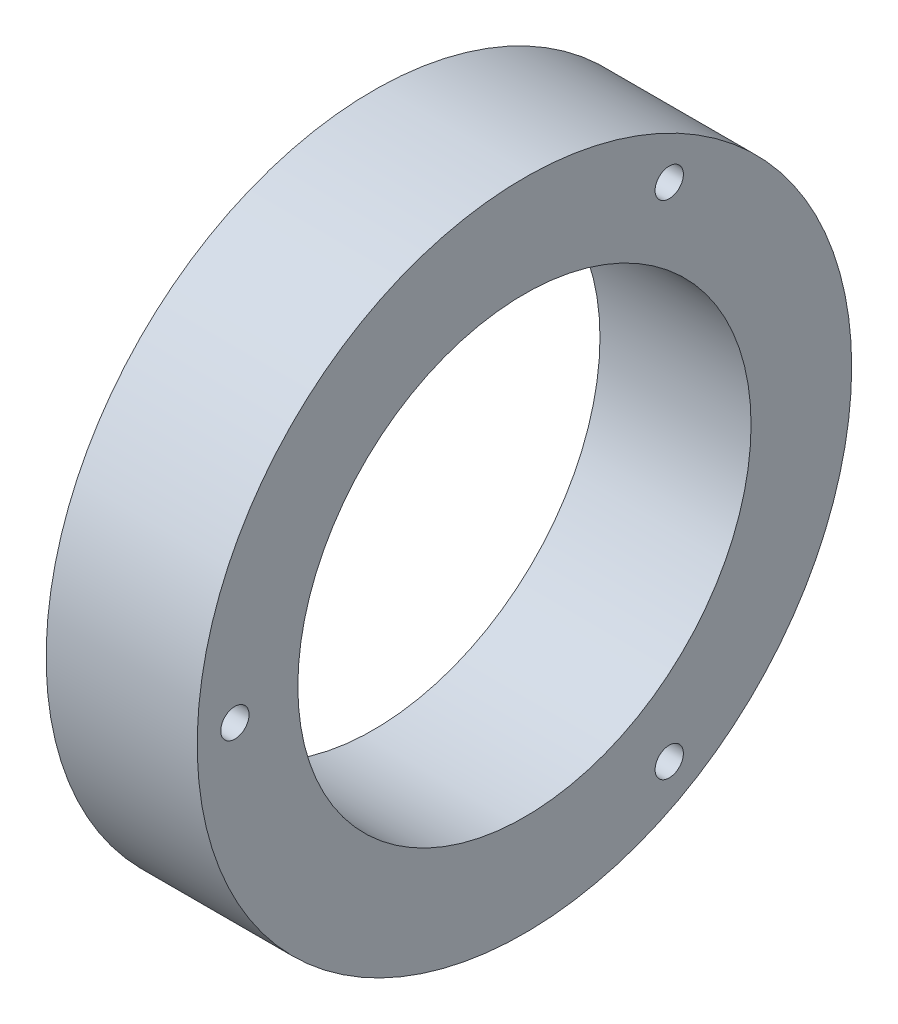
ISO-10303-21;
HEADER;
FILE_DESCRIPTION(('STEP AP214'),'2;1');
FILE_NAME('part.step','',(''),(''),'','','');
FILE_SCHEMA(('AUTOMOTIVE_DESIGN { 1 0 10303 214 1 1 1 1 }'));
ENDSEC;
DATA;
#1=APPLICATION_CONTEXT('core data for automotive mechanical design processes');
#2=APPLICATION_PROTOCOL_DEFINITION('international standard','automotive_design',2000,#1);
#3=PRODUCT_CONTEXT('',#1,'mechanical');
#4=PRODUCT('Part','Part','',(#3));
#5=PRODUCT_RELATED_PRODUCT_CATEGORY('part','',(#4));
#6=PRODUCT_DEFINITION_FORMATION('','',#4);
#7=PRODUCT_DEFINITION_CONTEXT('part definition',#1,'design');
#8=PRODUCT_DEFINITION('design','',#6,#7);
#9=PRODUCT_DEFINITION_SHAPE('','',#8);
#10=(LENGTH_UNIT() NAMED_UNIT(*) SI_UNIT(.MILLI.,.METRE.));
#11=(NAMED_UNIT(*) PLANE_ANGLE_UNIT() SI_UNIT($,.RADIAN.));
#12=(NAMED_UNIT(*) SI_UNIT($,.STERADIAN.) SOLID_ANGLE_UNIT());
#13=UNCERTAINTY_MEASURE_WITH_UNIT(LENGTH_MEASURE(1.E-05),#10,'distance_accuracy_value','');
#14=(GEOMETRIC_REPRESENTATION_CONTEXT(3) GLOBAL_UNCERTAINTY_ASSIGNED_CONTEXT((#13)) GLOBAL_UNIT_ASSIGNED_CONTEXT((#10,
#11,#12)) REPRESENTATION_CONTEXT('',''));
#15=CARTESIAN_POINT('',(0.,0.,0.));
#16=DIRECTION('',(0.,0.,1.));
#17=DIRECTION('',(1.,0.,0.));
#18=AXIS2_PLACEMENT_3D('',#15,#16,#17);
#19=CARTESIAN_POINT('',(38.1,0.,0.));
#20=DIRECTION('',(-1.,0.,0.));
#21=DIRECTION('',(0.,0.,1.));
#22=AXIS2_PLACEMENT_3D('',#19,#20,#21);
#23=CYLINDRICAL_SURFACE('',#22,82.5246);
#24=CARTESIAN_POINT('',(38.1,0.,0.));
#25=DIRECTION('',(1.,0.,0.));
#26=DIRECTION('',(0.,0.,-1.));
#27=AXIS2_PLACEMENT_3D('',#24,#25,#26);
#28=CIRCLE('',#27,82.5246);
#29=CARTESIAN_POINT('',(38.1,0.,-82.5246));
#30=VERTEX_POINT('',#29);
#31=EDGE_CURVE('E10',#30,#30,#28,.T.);
#32=ORIENTED_EDGE('',*,*,#31,.F.);
#33=EDGE_LOOP('',(#32));
#34=FACE_BOUND('',#33,.T.);
#35=CARTESIAN_POINT('',(0.,0.,0.));
#36=DIRECTION('',(1.,0.,0.));
#37=DIRECTION('',(0.,0.,-1.));
#38=AXIS2_PLACEMENT_3D('',#35,#36,#37);
#39=CIRCLE('',#38,82.5246);
#40=CARTESIAN_POINT('',(0.,0.,-82.5246));
#41=VERTEX_POINT('',#40);
#42=EDGE_CURVE('E44',#41,#41,#39,.T.);
#43=ORIENTED_EDGE('',*,*,#42,.T.);
#44=EDGE_LOOP('',(#43));
#45=FACE_BOUND('',#44,.T.);
#46=ADVANCED_FACE('F37',(#34,#45),#23,.T.);
#47=CARTESIAN_POINT('',(38.1,0.,0.));
#48=DIRECTION('',(1.,0.,0.));
#49=DIRECTION('',(0.,0.,-1.));
#50=AXIS2_PLACEMENT_3D('',#47,#48,#49);
#51=PLANE('',#50);
#52=CARTESIAN_POINT('',(38.1,0.,73.025));
#53=DIRECTION('',(1.,0.,0.));
#54=DIRECTION('',(0.,0.,-1.));
#55=AXIS2_PLACEMENT_3D('',#52,#53,#54);
#56=CIRCLE('',#55,3.56870000000001);
#57=CARTESIAN_POINT('',(38.1,0.,69.4563));
#58=VERTEX_POINT('',#57);
#59=EDGE_CURVE('E72',#58,#58,#56,.T.);
#60=ORIENTED_EDGE('',*,*,#59,.F.);
#61=EDGE_LOOP('',(#60));
#62=FACE_BOUND('',#61,.T.);
#63=CARTESIAN_POINT('',(38.1,-63.2415051113586,-36.5125));
#64=DIRECTION('',(1.,0.,0.));
#65=DIRECTION('',(0.,0.,-1.));
#66=AXIS2_PLACEMENT_3D('',#63,#64,#65);
#67=CIRCLE('',#66,3.5687);
#68=CARTESIAN_POINT('',(38.1,-63.2415051113586,-40.0812));
#69=VERTEX_POINT('',#68);
#70=EDGE_CURVE('E67',#69,#69,#67,.T.);
#71=ORIENTED_EDGE('',*,*,#70,.F.);
#72=EDGE_LOOP('',(#71));
#73=FACE_BOUND('',#72,.T.);
#74=CARTESIAN_POINT('',(38.1,63.2415051113586,-36.5125));
#75=DIRECTION('',(1.,0.,0.));
#76=DIRECTION('',(0.,0.,-1.));
#77=AXIS2_PLACEMENT_3D('',#74,#75,#76);
#78=CIRCLE('',#77,3.5687);
#79=CARTESIAN_POINT('',(38.1,63.2415051113586,-40.0812));
#80=VERTEX_POINT('',#79);
#81=EDGE_CURVE('E63',#80,#80,#78,.T.);
#82=ORIENTED_EDGE('',*,*,#81,.F.);
#83=EDGE_LOOP('',(#82));
#84=FACE_BOUND('',#83,.T.);
#85=CARTESIAN_POINT('',(38.1,0.,0.));
#86=DIRECTION('',(1.,0.,0.));
#87=DIRECTION('',(0.,0.,-1.));
#88=AXIS2_PLACEMENT_3D('',#85,#86,#87);
#89=CIRCLE('',#88,57.15);
#90=CARTESIAN_POINT('',(38.1,0.,-57.15));
#91=VERTEX_POINT('',#90);
#92=EDGE_CURVE('E49',#91,#91,#89,.T.);
#93=ORIENTED_EDGE('',*,*,#92,.F.);
#94=EDGE_LOOP('',(#93));
#95=FACE_BOUND('',#94,.T.);
#96=ORIENTED_EDGE('',*,*,#31,.T.);
#97=EDGE_LOOP('',(#96));
#98=FACE_BOUND('',#97,.T.);
#99=ADVANCED_FACE('F121',(#62,#73,#84,#95,#98),#51,.T.);
#100=CARTESIAN_POINT('',(0.,0.,0.));
#101=DIRECTION('',(1.,0.,0.));
#102=DIRECTION('',(0.,0.,-1.));
#103=AXIS2_PLACEMENT_3D('',#100,#101,#102);
#104=PLANE('',#103);
#105=CARTESIAN_POINT('',(0.,0.,73.025));
#106=DIRECTION('',(1.,0.,0.));
#107=DIRECTION('',(0.,0.,-1.));
#108=AXIS2_PLACEMENT_3D('',#105,#106,#107);
#109=CIRCLE('',#108,5.5626);
#110=CARTESIAN_POINT('',(0.,0.,67.4624));
#111=VERTEX_POINT('',#110);
#112=EDGE_CURVE('E97',#111,#111,#109,.T.);
#113=ORIENTED_EDGE('',*,*,#112,.T.);
#114=EDGE_LOOP('',(#113));
#115=FACE_BOUND('',#114,.T.);
#116=CARTESIAN_POINT('',(0.,-63.2415051113586,-36.5125));
#117=DIRECTION('',(1.,0.,0.));
#118=DIRECTION('',(0.,0.,-1.));
#119=AXIS2_PLACEMENT_3D('',#116,#117,#118);
#120=CIRCLE('',#119,5.5626);
#121=CARTESIAN_POINT('',(0.,-63.2415051113586,-42.0751));
#122=VERTEX_POINT('',#121);
#123=EDGE_CURVE('E94',#122,#122,#120,.T.);
#124=ORIENTED_EDGE('',*,*,#123,.T.);
#125=EDGE_LOOP('',(#124));
#126=FACE_BOUND('',#125,.T.);
#127=CARTESIAN_POINT('',(0.,63.2415051113586,-36.5125));
#128=DIRECTION('',(1.,0.,0.));
#129=DIRECTION('',(0.,0.,-1.));
#130=AXIS2_PLACEMENT_3D('',#127,#128,#129);
#131=CIRCLE('',#130,5.5626);
#132=CARTESIAN_POINT('',(0.,63.2415051113586,-42.0751));
#133=VERTEX_POINT('',#132);
#134=EDGE_CURVE('E88',#133,#133,#131,.T.);
#135=ORIENTED_EDGE('',*,*,#134,.T.);
#136=EDGE_LOOP('',(#135));
#137=FACE_BOUND('',#136,.T.);
#138=CARTESIAN_POINT('',(0.,0.,0.));
#139=DIRECTION('',(1.,0.,0.));
#140=DIRECTION('',(0.,0.,-1.));
#141=AXIS2_PLACEMENT_3D('',#138,#139,#140);
#142=CIRCLE('',#141,57.15);
#143=CARTESIAN_POINT('',(0.,0.,-57.15));
#144=VERTEX_POINT('',#143);
#145=EDGE_CURVE('E52',#144,#144,#142,.T.);
#146=ORIENTED_EDGE('',*,*,#145,.T.);
#147=EDGE_LOOP('',(#146));
#148=FACE_BOUND('',#147,.T.);
#149=ORIENTED_EDGE('',*,*,#42,.F.);
#150=EDGE_LOOP('',(#149));
#151=FACE_BOUND('',#150,.T.);
#152=ADVANCED_FACE('F127',(#115,#126,#137,#148,#151),#104,.F.);
#153=CARTESIAN_POINT('',(38.1,0.,0.));
#154=DIRECTION('',(-1.,0.,0.));
#155=DIRECTION('',(0.,0.,1.));
#156=AXIS2_PLACEMENT_3D('',#153,#154,#155);
#157=CYLINDRICAL_SURFACE('',#156,57.15);
#158=ORIENTED_EDGE('',*,*,#92,.T.);
#159=EDGE_LOOP('',(#158));
#160=FACE_BOUND('',#159,.T.);
#161=ORIENTED_EDGE('',*,*,#145,.F.);
#162=EDGE_LOOP('',(#161));
#163=FACE_BOUND('',#162,.T.);
#164=ADVANCED_FACE('F134',(#160,#163),#157,.F.);
#165=CARTESIAN_POINT('',(38.1,63.2415051113586,-36.5125));
#166=DIRECTION('',(-1.,0.,0.));
#167=DIRECTION('',(0.,0.,1.));
#168=AXIS2_PLACEMENT_3D('',#165,#166,#167);
#169=CYLINDRICAL_SURFACE('',#168,3.5687);
#170=CARTESIAN_POINT('',(9.652,63.2415051113586,-36.5125));
#171=DIRECTION('',(1.,0.,0.));
#172=DIRECTION('',(0.,0.,-1.));
#173=AXIS2_PLACEMENT_3D('',#170,#171,#172);
#174=CIRCLE('',#173,3.5687);
#175=CARTESIAN_POINT('',(9.652,63.2415051113586,-40.0812));
#176=VERTEX_POINT('',#175);
#177=EDGE_CURVE('E40',#176,#176,#174,.T.);
#178=ORIENTED_EDGE('',*,*,#177,.F.);
#179=EDGE_LOOP('',(#178));
#180=FACE_BOUND('',#179,.T.);
#181=ORIENTED_EDGE('',*,*,#81,.T.);
#182=EDGE_LOOP('',(#181));
#183=FACE_BOUND('',#182,.T.);
#184=ADVANCED_FACE('F139',(#180,#183),#169,.F.);
#185=CARTESIAN_POINT('',(38.1,-63.2415051113586,-36.5125));
#186=DIRECTION('',(-1.,0.,0.));
#187=DIRECTION('',(0.,0.,1.));
#188=AXIS2_PLACEMENT_3D('',#185,#186,#187);
#189=CYLINDRICAL_SURFACE('',#188,3.5687);
#190=CARTESIAN_POINT('',(9.652,-63.2415051113586,-36.5125));
#191=DIRECTION('',(1.,0.,0.));
#192=DIRECTION('',(0.,0.,-1.));
#193=AXIS2_PLACEMENT_3D('',#190,#191,#192);
#194=CIRCLE('',#193,3.5687);
#195=CARTESIAN_POINT('',(9.652,-63.2415051113586,-40.0812));
#196=VERTEX_POINT('',#195);
#197=EDGE_CURVE('E57',#196,#196,#194,.T.);
#198=ORIENTED_EDGE('',*,*,#197,.F.);
#199=EDGE_LOOP('',(#198));
#200=FACE_BOUND('',#199,.T.);
#201=ORIENTED_EDGE('',*,*,#70,.T.);
#202=EDGE_LOOP('',(#201));
#203=FACE_BOUND('',#202,.T.);
#204=ADVANCED_FACE('F144',(#200,#203),#189,.F.);
#205=CARTESIAN_POINT('',(38.1,0.,73.025));
#206=DIRECTION('',(-1.,0.,0.));
#207=DIRECTION('',(0.,0.,1.));
#208=AXIS2_PLACEMENT_3D('',#205,#206,#207);
#209=CYLINDRICAL_SURFACE('',#208,3.56870000000001);
#210=CARTESIAN_POINT('',(9.652,0.,73.025));
#211=DIRECTION('',(1.,0.,0.));
#212=DIRECTION('',(0.,0.,-1.));
#213=AXIS2_PLACEMENT_3D('',#210,#211,#212);
#214=CIRCLE('',#213,3.56870000000001);
#215=CARTESIAN_POINT('',(9.652,0.,69.4563));
#216=VERTEX_POINT('',#215);
#217=EDGE_CURVE('E55',#216,#216,#214,.T.);
#218=ORIENTED_EDGE('',*,*,#217,.F.);
#219=EDGE_LOOP('',(#218));
#220=FACE_BOUND('',#219,.T.);
#221=ORIENTED_EDGE('',*,*,#59,.T.);
#222=EDGE_LOOP('',(#221));
#223=FACE_BOUND('',#222,.T.);
#224=ADVANCED_FACE('F118',(#220,#223),#209,.F.);
#225=CARTESIAN_POINT('',(9.652,0.,73.025));
#226=DIRECTION('',(-1.,0.,0.));
#227=DIRECTION('',(0.,0.,1.));
#228=AXIS2_PLACEMENT_3D('',#225,#226,#227);
#229=CYLINDRICAL_SURFACE('',#228,5.5626);
#230=CARTESIAN_POINT('',(9.652,0.,73.025));
#231=DIRECTION('',(1.,0.,0.));
#232=DIRECTION('',(0.,0.,-1.));
#233=AXIS2_PLACEMENT_3D('',#230,#231,#232);
#234=CIRCLE('',#233,5.5626);
#235=CARTESIAN_POINT('',(9.652,0.,67.4624));
#236=VERTEX_POINT('',#235);
#237=EDGE_CURVE('E58',#236,#236,#234,.T.);
#238=ORIENTED_EDGE('',*,*,#237,.T.);
#239=EDGE_LOOP('',(#238));
#240=FACE_BOUND('',#239,.T.);
#241=ORIENTED_EDGE('',*,*,#112,.F.);
#242=EDGE_LOOP('',(#241));
#243=FACE_BOUND('',#242,.T.);
#244=ADVANCED_FACE('F103',(#240,#243),#229,.F.);
#245=CARTESIAN_POINT('',(9.652,0.,73.025));
#246=DIRECTION('',(1.,0.,0.));
#247=DIRECTION('',(0.,0.,-1.));
#248=AXIS2_PLACEMENT_3D('',#245,#246,#247);
#249=PLANE('',#248);
#250=ORIENTED_EDGE('',*,*,#217,.T.);
#251=EDGE_LOOP('',(#250));
#252=FACE_BOUND('',#251,.T.);
#253=ORIENTED_EDGE('',*,*,#237,.F.);
#254=EDGE_LOOP('',(#253));
#255=FACE_BOUND('',#254,.T.);
#256=ADVANCED_FACE('F106',(#252,#255),#249,.F.);
#257=CARTESIAN_POINT('',(9.652,-63.2415051113586,-36.5125));
#258=DIRECTION('',(-1.,0.,0.));
#259=DIRECTION('',(0.,0.,1.));
#260=AXIS2_PLACEMENT_3D('',#257,#258,#259);
#261=CYLINDRICAL_SURFACE('',#260,5.5626);
#262=CARTESIAN_POINT('',(9.652,-63.2415051113586,-36.5125));
#263=DIRECTION('',(1.,0.,0.));
#264=DIRECTION('',(0.,0.,-1.));
#265=AXIS2_PLACEMENT_3D('',#262,#263,#264);
#266=CIRCLE('',#265,5.5626);
#267=CARTESIAN_POINT('',(9.652,-63.2415051113586,-42.0751));
#268=VERTEX_POINT('',#267);
#269=EDGE_CURVE('E91',#268,#268,#266,.T.);
#270=ORIENTED_EDGE('',*,*,#269,.T.);
#271=EDGE_LOOP('',(#270));
#272=FACE_BOUND('',#271,.T.);
#273=ORIENTED_EDGE('',*,*,#123,.F.);
#274=EDGE_LOOP('',(#273));
#275=FACE_BOUND('',#274,.T.);
#276=ADVANCED_FACE('F108',(#272,#275),#261,.F.);
#277=CARTESIAN_POINT('',(9.652,-63.2415051113586,-36.5125));
#278=DIRECTION('',(1.,0.,0.));
#279=DIRECTION('',(0.,0.,-1.));
#280=AXIS2_PLACEMENT_3D('',#277,#278,#279);
#281=PLANE('',#280);
#282=ORIENTED_EDGE('',*,*,#197,.T.);
#283=EDGE_LOOP('',(#282));
#284=FACE_BOUND('',#283,.T.);
#285=ORIENTED_EDGE('',*,*,#269,.F.);
#286=EDGE_LOOP('',(#285));
#287=FACE_BOUND('',#286,.T.);
#288=ADVANCED_FACE('F115',(#284,#287),#281,.F.);
#289=CARTESIAN_POINT('',(9.652,63.2415051113586,-36.5125));
#290=DIRECTION('',(-1.,0.,0.));
#291=DIRECTION('',(0.,0.,1.));
#292=AXIS2_PLACEMENT_3D('',#289,#290,#291);
#293=CYLINDRICAL_SURFACE('',#292,5.5626);
#294=CARTESIAN_POINT('',(9.652,63.2415051113586,-36.5125));
#295=DIRECTION('',(1.,0.,0.));
#296=DIRECTION('',(0.,0.,-1.));
#297=AXIS2_PLACEMENT_3D('',#294,#295,#296);
#298=CIRCLE('',#297,5.5626);
#299=CARTESIAN_POINT('',(9.652,63.2415051113586,-42.0751));
#300=VERTEX_POINT('',#299);
#301=EDGE_CURVE('E85',#300,#300,#298,.T.);
#302=ORIENTED_EDGE('',*,*,#301,.T.);
#303=EDGE_LOOP('',(#302));
#304=FACE_BOUND('',#303,.T.);
#305=ORIENTED_EDGE('',*,*,#134,.F.);
#306=EDGE_LOOP('',(#305));
#307=FACE_BOUND('',#306,.T.);
#308=ADVANCED_FACE('F155',(#304,#307),#293,.F.);
#309=CARTESIAN_POINT('',(9.652,63.2415051113586,-36.5125));
#310=DIRECTION('',(1.,0.,0.));
#311=DIRECTION('',(0.,0.,-1.));
#312=AXIS2_PLACEMENT_3D('',#309,#310,#311);
#313=PLANE('',#312);
#314=ORIENTED_EDGE('',*,*,#177,.T.);
#315=EDGE_LOOP('',(#314));
#316=FACE_BOUND('',#315,.T.);
#317=ORIENTED_EDGE('',*,*,#301,.F.);
#318=EDGE_LOOP('',(#317));
#319=FACE_BOUND('',#318,.T.);
#320=ADVANCED_FACE('F152',(#316,#319),#313,.F.);
#321=CLOSED_SHELL('',(#46,#99,#152,#164,#184,#204,#224,#244,#256,#276,#288,#308,#320));
#322=MANIFOLD_SOLID_BREP('B2',#321);
#323=ADVANCED_BREP_SHAPE_REPRESENTATION('',(#18,#322),#14);
#324=SHAPE_DEFINITION_REPRESENTATION(#9,#323);
ENDSEC;
END-ISO-10303-21;
